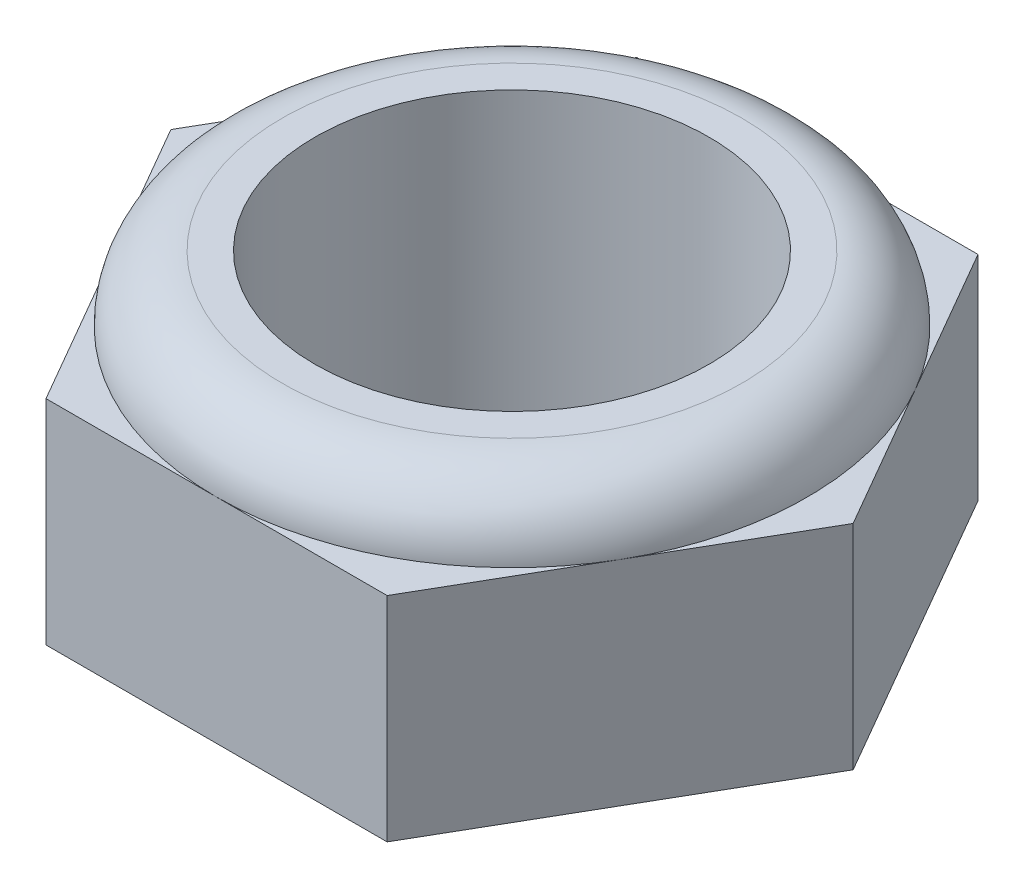
ISO-10303-21;
HEADER;
FILE_DESCRIPTION(('STEP AP214'),'2;1');
FILE_NAME('part.step','',(''),(''),'','','');
FILE_SCHEMA(('AUTOMOTIVE_DESIGN { 1 0 10303 214 1 1 1 1 }'));
ENDSEC;
DATA;
#1=APPLICATION_CONTEXT('core data for automotive mechanical design processes');
#2=APPLICATION_PROTOCOL_DEFINITION('international standard','automotive_design',2000,#1);
#3=PRODUCT_CONTEXT('',#1,'mechanical');
#4=PRODUCT('Part','Part','',(#3));
#5=PRODUCT_RELATED_PRODUCT_CATEGORY('part','',(#4));
#6=PRODUCT_DEFINITION_FORMATION('','',#4);
#7=PRODUCT_DEFINITION_CONTEXT('part definition',#1,'design');
#8=PRODUCT_DEFINITION('design','',#6,#7);
#9=PRODUCT_DEFINITION_SHAPE('','',#8);
#10=(LENGTH_UNIT() NAMED_UNIT(*) SI_UNIT(.MILLI.,.METRE.));
#11=(NAMED_UNIT(*) PLANE_ANGLE_UNIT() SI_UNIT($,.RADIAN.));
#12=(NAMED_UNIT(*) SI_UNIT($,.STERADIAN.) SOLID_ANGLE_UNIT());
#13=UNCERTAINTY_MEASURE_WITH_UNIT(LENGTH_MEASURE(1.E-05),#10,'distance_accuracy_value','');
#14=(GEOMETRIC_REPRESENTATION_CONTEXT(3) GLOBAL_UNCERTAINTY_ASSIGNED_CONTEXT((#13)) GLOBAL_UNIT_ASSIGNED_CONTEXT((#10,
#11,#12)) REPRESENTATION_CONTEXT('',''));
#15=CARTESIAN_POINT('',(0.,0.,0.));
#16=DIRECTION('',(0.,0.,1.));
#17=DIRECTION('',(1.,0.,0.));
#18=AXIS2_PLACEMENT_3D('',#15,#16,#17);
#19=CARTESIAN_POINT('',(8.24889197104678,6.746875,0.));
#20=DIRECTION('',(-0.866025403784438,0.,0.5));
#21=DIRECTION('',(0.5,0.,0.866025403784439));
#22=AXIS2_PLACEMENT_3D('',#19,#20,#21);
#23=PLANE('',#22);
#24=DIRECTION('',(-0.5,0.,-0.866025403784439));
#25=VECTOR('',#24,1.);
#26=CARTESIAN_POINT('',(8.24889197104678,5.159375,0.));
#27=LINE('',#26,#25);
#28=CARTESIAN_POINT('',(8.24889197104678,5.159375,0.));
#29=VERTEX_POINT('',#28);
#30=CARTESIAN_POINT('',(6.18666897828508,5.159375,-3.571875));
#31=VERTEX_POINT('',#30);
#32=EDGE_CURVE('E144',#29,#31,#27,.T.);
#33=ORIENTED_EDGE('',*,*,#32,.F.);
#34=DIRECTION('',(0.,-1.,0.));
#35=VECTOR('',#34,1.);
#36=CARTESIAN_POINT('',(8.24889197104678,6.746875,0.));
#37=LINE('',#36,#35);
#38=CARTESIAN_POINT('',(8.24889197104678,0.,0.));
#39=VERTEX_POINT('',#38);
#40=EDGE_CURVE('E60',#29,#39,#37,.T.);
#41=ORIENTED_EDGE('',*,*,#40,.T.);
#42=DIRECTION('',(-0.5,0.,-0.866025403784438));
#43=VECTOR('',#42,1.);
#44=CARTESIAN_POINT('',(8.24889197104678,0.,0.));
#45=LINE('',#44,#43);
#46=CARTESIAN_POINT('',(4.12444598552339,0.,-7.14375));
#47=VERTEX_POINT('',#46);
#48=EDGE_CURVE('E148',#39,#47,#45,.T.);
#49=ORIENTED_EDGE('',*,*,#48,.T.);
#50=DIRECTION('',(0.,-1.,0.));
#51=VECTOR('',#50,1.);
#52=CARTESIAN_POINT('',(4.12444598552339,6.746875,-7.14375));
#53=LINE('',#52,#51);
#54=CARTESIAN_POINT('',(4.12444598552339,5.159375,-7.14375));
#55=VERTEX_POINT('',#54);
#56=EDGE_CURVE('E173',#55,#47,#53,.T.);
#57=ORIENTED_EDGE('',*,*,#56,.F.);
#58=EDGE_CURVE('E116',#31,#55,#27,.T.);
#59=ORIENTED_EDGE('',*,*,#58,.F.);
#60=EDGE_LOOP('',(#33,#41,#49,#57,#59));
#61=FACE_BOUND('',#60,.T.);
#62=ADVANCED_FACE('F38',(#61),#23,.F.);
#63=CARTESIAN_POINT('',(4.12444598552339,6.746875,-7.14375));
#64=DIRECTION('',(0.,0.,1.));
#65=DIRECTION('',(1.,0.,0.));
#66=AXIS2_PLACEMENT_3D('',#63,#64,#65);
#67=PLANE('',#66);
#68=DIRECTION('',(-1.,0.,0.));
#69=VECTOR('',#68,1.);
#70=CARTESIAN_POINT('',(4.12444598552339,5.159375,-7.14375));
#71=LINE('',#70,#69);
#72=CARTESIAN_POINT('',(0.,5.159375,-7.14375));
#73=VERTEX_POINT('',#72);
#74=EDGE_CURVE('E110',#55,#73,#71,.T.);
#75=ORIENTED_EDGE('',*,*,#74,.F.);
#76=ORIENTED_EDGE('',*,*,#56,.T.);
#77=DIRECTION('',(-1.,0.,0.));
#78=VECTOR('',#77,1.);
#79=CARTESIAN_POINT('',(4.12444598552339,0.,-7.14375));
#80=LINE('',#79,#78);
#81=CARTESIAN_POINT('',(-4.12444598552339,0.,-7.14375));
#82=VERTEX_POINT('',#81);
#83=EDGE_CURVE('E153',#47,#82,#80,.T.);
#84=ORIENTED_EDGE('',*,*,#83,.T.);
#85=DIRECTION('',(0.,-1.,0.));
#86=VECTOR('',#85,1.);
#87=CARTESIAN_POINT('',(-4.12444598552339,6.746875,-7.14375));
#88=LINE('',#87,#86);
#89=CARTESIAN_POINT('',(-4.12444598552339,5.159375,-7.14375));
#90=VERTEX_POINT('',#89);
#91=EDGE_CURVE('E138',#90,#82,#88,.T.);
#92=ORIENTED_EDGE('',*,*,#91,.F.);
#93=EDGE_CURVE('E120',#73,#90,#71,.T.);
#94=ORIENTED_EDGE('',*,*,#93,.F.);
#95=EDGE_LOOP('',(#75,#76,#84,#92,#94));
#96=FACE_BOUND('',#95,.T.);
#97=ADVANCED_FACE('F136',(#96),#67,.F.);
#98=CARTESIAN_POINT('',(-4.12444598552339,6.746875,-7.14375));
#99=DIRECTION('',(0.866025403784439,0.,0.5));
#100=DIRECTION('',(0.5,0.,-0.866025403784439));
#101=AXIS2_PLACEMENT_3D('',#98,#99,#100);
#102=PLANE('',#101);
#103=DIRECTION('',(-0.5,0.,0.866025403784439));
#104=VECTOR('',#103,1.);
#105=CARTESIAN_POINT('',(-4.12444598552339,5.159375,-7.14375));
#106=LINE('',#105,#104);
#107=CARTESIAN_POINT('',(-6.18666897828508,5.159375,-3.571875));
#108=VERTEX_POINT('',#107);
#109=EDGE_CURVE('E127',#90,#108,#106,.T.);
#110=ORIENTED_EDGE('',*,*,#109,.F.);
#111=ORIENTED_EDGE('',*,*,#91,.T.);
#112=DIRECTION('',(-0.5,0.,0.866025403784439));
#113=VECTOR('',#112,1.);
#114=CARTESIAN_POINT('',(-4.12444598552339,0.,-7.14375));
#115=LINE('',#114,#113);
#116=CARTESIAN_POINT('',(-8.24889197104678,0.,0.));
#117=VERTEX_POINT('',#116);
#118=EDGE_CURVE('E155',#82,#117,#115,.T.);
#119=ORIENTED_EDGE('',*,*,#118,.T.);
#120=DIRECTION('',(0.,-1.,0.));
#121=VECTOR('',#120,1.);
#122=CARTESIAN_POINT('',(-8.24889197104678,6.746875,0.));
#123=LINE('',#122,#121);
#124=CARTESIAN_POINT('',(-8.24889197104678,5.159375,0.));
#125=VERTEX_POINT('',#124);
#126=EDGE_CURVE('E171',#125,#117,#123,.T.);
#127=ORIENTED_EDGE('',*,*,#126,.F.);
#128=EDGE_CURVE('E139',#108,#125,#106,.T.);
#129=ORIENTED_EDGE('',*,*,#128,.F.);
#130=EDGE_LOOP('',(#110,#111,#119,#127,#129));
#131=FACE_BOUND('',#130,.T.);
#132=ADVANCED_FACE('F190',(#131),#102,.F.);
#133=CARTESIAN_POINT('',(-8.24889197104678,6.746875,0.));
#134=DIRECTION('',(0.866025403784439,0.,-0.5));
#135=DIRECTION('',(-0.5,0.,-0.866025403784439));
#136=AXIS2_PLACEMENT_3D('',#133,#134,#135);
#137=PLANE('',#136);
#138=DIRECTION('',(0.5,0.,0.866025403784439));
#139=VECTOR('',#138,1.);
#140=CARTESIAN_POINT('',(-8.24889197104678,5.159375,0.));
#141=LINE('',#140,#139);
#142=CARTESIAN_POINT('',(-6.18666897828509,5.159375,3.571875));
#143=VERTEX_POINT('',#142);
#144=EDGE_CURVE('E194',#125,#143,#141,.T.);
#145=ORIENTED_EDGE('',*,*,#144,.F.);
#146=ORIENTED_EDGE('',*,*,#126,.T.);
#147=DIRECTION('',(0.5,0.,0.866025403784439));
#148=VECTOR('',#147,1.);
#149=CARTESIAN_POINT('',(-8.24889197104678,0.,0.));
#150=LINE('',#149,#148);
#151=CARTESIAN_POINT('',(-4.12444598552339,0.,7.14375));
#152=VERTEX_POINT('',#151);
#153=EDGE_CURVE('E158',#117,#152,#150,.T.);
#154=ORIENTED_EDGE('',*,*,#153,.T.);
#155=DIRECTION('',(0.,-1.,0.));
#156=VECTOR('',#155,1.);
#157=CARTESIAN_POINT('',(-4.12444598552339,6.746875,7.14375));
#158=LINE('',#157,#156);
#159=CARTESIAN_POINT('',(-4.12444598552339,5.159375,7.14375));
#160=VERTEX_POINT('',#159);
#161=EDGE_CURVE('E169',#160,#152,#158,.T.);
#162=ORIENTED_EDGE('',*,*,#161,.F.);
#163=EDGE_CURVE('E195',#143,#160,#141,.T.);
#164=ORIENTED_EDGE('',*,*,#163,.F.);
#165=EDGE_LOOP('',(#145,#146,#154,#162,#164));
#166=FACE_BOUND('',#165,.T.);
#167=ADVANCED_FACE('F226',(#166),#137,.F.);
#168=CARTESIAN_POINT('',(-4.12444598552339,6.746875,7.14375));
#169=DIRECTION('',(0.,0.,-1.));
#170=DIRECTION('',(-1.,0.,0.));
#171=AXIS2_PLACEMENT_3D('',#168,#169,#170);
#172=PLANE('',#171);
#173=DIRECTION('',(1.,0.,0.));
#174=VECTOR('',#173,1.);
#175=CARTESIAN_POINT('',(-4.12444598552339,5.159375,7.14375));
#176=LINE('',#175,#174);
#177=CARTESIAN_POINT('',(0.,5.159375,7.14375));
#178=VERTEX_POINT('',#177);
#179=EDGE_CURVE('E196',#160,#178,#176,.T.);
#180=ORIENTED_EDGE('',*,*,#179,.F.);
#181=ORIENTED_EDGE('',*,*,#161,.T.);
#182=DIRECTION('',(1.,0.,0.));
#183=VECTOR('',#182,1.);
#184=CARTESIAN_POINT('',(-4.12444598552339,0.,7.14375));
#185=LINE('',#184,#183);
#186=CARTESIAN_POINT('',(4.12444598552339,0.,7.14375));
#187=VERTEX_POINT('',#186);
#188=EDGE_CURVE('E161',#152,#187,#185,.T.);
#189=ORIENTED_EDGE('',*,*,#188,.T.);
#190=DIRECTION('',(0.,-1.,0.));
#191=VECTOR('',#190,1.);
#192=CARTESIAN_POINT('',(4.12444598552339,6.746875,7.14375));
#193=LINE('',#192,#191);
#194=CARTESIAN_POINT('',(4.12444598552339,5.159375,7.14375));
#195=VERTEX_POINT('',#194);
#196=EDGE_CURVE('E167',#195,#187,#193,.T.);
#197=ORIENTED_EDGE('',*,*,#196,.F.);
#198=EDGE_CURVE('E198',#178,#195,#176,.T.);
#199=ORIENTED_EDGE('',*,*,#198,.F.);
#200=EDGE_LOOP('',(#180,#181,#189,#197,#199));
#201=FACE_BOUND('',#200,.T.);
#202=ADVANCED_FACE('F215',(#201),#172,.F.);
#203=CARTESIAN_POINT('',(4.12444598552339,6.746875,7.14375));
#204=DIRECTION('',(-0.866025403784439,0.,-0.5));
#205=DIRECTION('',(-0.5,0.,0.866025403784439));
#206=AXIS2_PLACEMENT_3D('',#203,#204,#205);
#207=PLANE('',#206);
#208=DIRECTION('',(0.5,0.,-0.866025403784439));
#209=VECTOR('',#208,1.);
#210=CARTESIAN_POINT('',(4.12444598552339,5.159375,7.14375));
#211=LINE('',#210,#209);
#212=CARTESIAN_POINT('',(6.18666897828509,5.159375,3.571875));
#213=VERTEX_POINT('',#212);
#214=EDGE_CURVE('E11',#195,#213,#211,.T.);
#215=ORIENTED_EDGE('',*,*,#214,.F.);
#216=ORIENTED_EDGE('',*,*,#196,.T.);
#217=DIRECTION('',(0.5,0.,-0.866025403784439));
#218=VECTOR('',#217,1.);
#219=CARTESIAN_POINT('',(4.12444598552339,0.,7.14375));
#220=LINE('',#219,#218);
#221=EDGE_CURVE('E164',#187,#39,#220,.T.);
#222=ORIENTED_EDGE('',*,*,#221,.T.);
#223=ORIENTED_EDGE('',*,*,#40,.F.);
#224=EDGE_CURVE('E41',#213,#29,#211,.T.);
#225=ORIENTED_EDGE('',*,*,#224,.F.);
#226=EDGE_LOOP('',(#215,#216,#222,#223,#225));
#227=FACE_BOUND('',#226,.T.);
#228=ADVANCED_FACE('F179',(#227),#207,.F.);
#229=CARTESIAN_POINT('',(0.,6.746875,0.));
#230=DIRECTION('',(0.,1.,0.));
#231=DIRECTION('',(0.,0.,1.));
#232=AXIS2_PLACEMENT_3D('',#229,#230,#231);
#233=PLANE('',#232);
#234=CARTESIAN_POINT('',(0.,6.746875,0.));
#235=DIRECTION('',(0.,1.,0.));
#236=DIRECTION('',(0.,0.,1.));
#237=AXIS2_PLACEMENT_3D('',#234,#235,#236);
#238=CIRCLE('',#237,4.7625);
#239=CARTESIAN_POINT('',(0.,6.746875,4.7625));
#240=VERTEX_POINT('',#239);
#241=EDGE_CURVE('E149',#240,#240,#238,.T.);
#242=ORIENTED_EDGE('',*,*,#241,.F.);
#243=EDGE_LOOP('',(#242));
#244=FACE_BOUND('',#243,.T.);
#245=CARTESIAN_POINT('',(0.,6.746875,0.));
#246=DIRECTION('',(0.,-1.,0.));
#247=DIRECTION('',(0.,0.,-1.));
#248=AXIS2_PLACEMENT_3D('',#245,#246,#247);
#249=CIRCLE('',#248,5.55625);
#250=CARTESIAN_POINT('',(0.,6.746875,-5.55625));
#251=VERTEX_POINT('',#250);
#252=EDGE_CURVE('E134',#251,#251,#249,.T.);
#253=ORIENTED_EDGE('',*,*,#252,.F.);
#254=EDGE_LOOP('',(#253));
#255=FACE_BOUND('',#254,.T.);
#256=ADVANCED_FACE('F204',(#244,#255),#233,.T.);
#257=CARTESIAN_POINT('',(0.,0.,0.));
#258=DIRECTION('',(0.,1.,0.));
#259=DIRECTION('',(0.,0.,1.));
#260=AXIS2_PLACEMENT_3D('',#257,#258,#259);
#261=PLANE('',#260);
#262=CARTESIAN_POINT('',(0.,0.,0.));
#263=DIRECTION('',(0.,1.,0.));
#264=DIRECTION('',(0.,0.,1.));
#265=AXIS2_PLACEMENT_3D('',#262,#263,#264);
#266=CIRCLE('',#265,4.7625);
#267=CARTESIAN_POINT('',(0.,0.,4.7625));
#268=VERTEX_POINT('',#267);
#269=EDGE_CURVE('E145',#268,#268,#266,.T.);
#270=ORIENTED_EDGE('',*,*,#269,.T.);
#271=EDGE_LOOP('',(#270));
#272=FACE_BOUND('',#271,.T.);
#273=ORIENTED_EDGE('',*,*,#48,.F.);
#274=ORIENTED_EDGE('',*,*,#221,.F.);
#275=ORIENTED_EDGE('',*,*,#188,.F.);
#276=ORIENTED_EDGE('',*,*,#153,.F.);
#277=ORIENTED_EDGE('',*,*,#118,.F.);
#278=ORIENTED_EDGE('',*,*,#83,.F.);
#279=EDGE_LOOP('',(#273,#274,#275,#276,#277,#278));
#280=FACE_BOUND('',#279,.T.);
#281=ADVANCED_FACE('F185',(#272,#280),#261,.F.);
#282=CARTESIAN_POINT('',(0.,0.,0.));
#283=DIRECTION('',(0.,1.,0.));
#284=DIRECTION('',(0.,0.,1.));
#285=AXIS2_PLACEMENT_3D('',#282,#283,#284);
#286=CYLINDRICAL_SURFACE('',#285,4.7625);
#287=ORIENTED_EDGE('',*,*,#269,.F.);
#288=EDGE_LOOP('',(#287));
#289=FACE_BOUND('',#288,.T.);
#290=ORIENTED_EDGE('',*,*,#241,.T.);
#291=EDGE_LOOP('',(#290));
#292=FACE_BOUND('',#291,.T.);
#293=ADVANCED_FACE('F212',(#289,#292),#286,.F.);
#294=CARTESIAN_POINT('',(0.,5.159375,7.14375));
#295=DIRECTION('',(0.,1.,0.));
#296=DIRECTION('',(0.,0.,1.));
#297=AXIS2_PLACEMENT_3D('',#294,#295,#296);
#298=PLANE('',#297);
#299=ORIENTED_EDGE('',*,*,#32,.T.);
#300=CARTESIAN_POINT('',(0.,5.159375,0.));
#301=DIRECTION('',(0.,-1.,0.));
#302=DIRECTION('',(0.,0.,-1.));
#303=AXIS2_PLACEMENT_3D('',#300,#301,#302);
#304=CIRCLE('',#303,7.14375);
#305=EDGE_CURVE('E52',#31,#213,#304,.T.);
#306=ORIENTED_EDGE('',*,*,#305,.T.);
#307=ORIENTED_EDGE('',*,*,#224,.T.);
#308=EDGE_LOOP('',(#299,#306,#307));
#309=FACE_BOUND('',#308,.T.);
#310=ADVANCED_FACE('F176',(#309),#298,.T.);
#311=ORIENTED_EDGE('',*,*,#58,.T.);
#312=ORIENTED_EDGE('',*,*,#74,.T.);
#313=EDGE_CURVE('E114',#73,#31,#304,.T.);
#314=ORIENTED_EDGE('',*,*,#313,.T.);
#315=EDGE_LOOP('',(#311,#312,#314));
#316=FACE_BOUND('',#315,.T.);
#317=ADVANCED_FACE('F112',(#316),#298,.T.);
#318=ORIENTED_EDGE('',*,*,#93,.T.);
#319=ORIENTED_EDGE('',*,*,#109,.T.);
#320=EDGE_CURVE('E124',#108,#73,#304,.T.);
#321=ORIENTED_EDGE('',*,*,#320,.T.);
#322=EDGE_LOOP('',(#318,#319,#321));
#323=FACE_BOUND('',#322,.T.);
#324=ADVANCED_FACE('F125',(#323),#298,.T.);
#325=ORIENTED_EDGE('',*,*,#128,.T.);
#326=ORIENTED_EDGE('',*,*,#144,.T.);
#327=EDGE_CURVE('E131',#143,#108,#304,.T.);
#328=ORIENTED_EDGE('',*,*,#327,.T.);
#329=EDGE_LOOP('',(#325,#326,#328));
#330=FACE_BOUND('',#329,.T.);
#331=ADVANCED_FACE('F247',(#330),#298,.T.);
#332=ORIENTED_EDGE('',*,*,#163,.T.);
#333=ORIENTED_EDGE('',*,*,#179,.T.);
#334=EDGE_CURVE('E244',#178,#143,#304,.T.);
#335=ORIENTED_EDGE('',*,*,#334,.T.);
#336=EDGE_LOOP('',(#332,#333,#335));
#337=FACE_BOUND('',#336,.T.);
#338=ADVANCED_FACE('F243',(#337),#298,.T.);
#339=ORIENTED_EDGE('',*,*,#198,.T.);
#340=ORIENTED_EDGE('',*,*,#214,.T.);
#341=EDGE_CURVE('E246',#213,#178,#304,.T.);
#342=ORIENTED_EDGE('',*,*,#341,.T.);
#343=EDGE_LOOP('',(#339,#340,#342));
#344=FACE_BOUND('',#343,.T.);
#345=ADVANCED_FACE('F254',(#344),#298,.T.);
#346=CARTESIAN_POINT('',(0.,5.159375,0.));
#347=DIRECTION('',(0.,-1.,0.));
#348=DIRECTION('',(0.,0.,-1.));
#349=AXIS2_PLACEMENT_3D('',#346,#347,#348);
#350=TOROIDAL_SURFACE('',#349,5.55625,1.5875);
#351=ORIENTED_EDGE('',*,*,#252,.T.);
#352=EDGE_LOOP('',(#351));
#353=FACE_BOUND('',#352,.T.);
#354=ORIENTED_EDGE('',*,*,#313,.F.);
#355=ORIENTED_EDGE('',*,*,#320,.F.);
#356=ORIENTED_EDGE('',*,*,#327,.F.);
#357=ORIENTED_EDGE('',*,*,#334,.F.);
#358=ORIENTED_EDGE('',*,*,#341,.F.);
#359=ORIENTED_EDGE('',*,*,#305,.F.);
#360=EDGE_LOOP('',(#354,#355,#356,#357,#358,#359));
#361=FACE_BOUND('',#360,.T.);
#362=ADVANCED_FACE('F133',(#353,#361),#350,.T.);
#363=CLOSED_SHELL('',(#62,#97,#132,#167,#202,#228,#256,#281,#293,#310,#317,#324,#331,#338,#345,#362));
#364=MANIFOLD_SOLID_BREP('B2',#363);
#365=ADVANCED_BREP_SHAPE_REPRESENTATION('',(#18,#364),#14);
#366=SHAPE_DEFINITION_REPRESENTATION(#9,#365);
ENDSEC;
END-ISO-10303-21;
